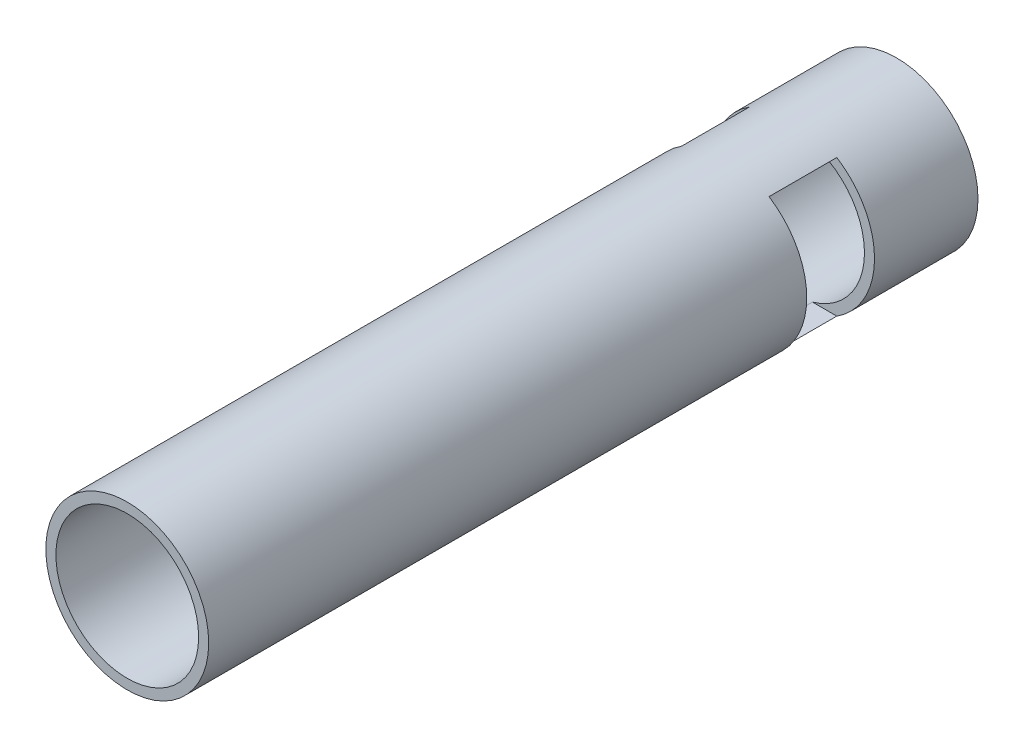
ISO-10303-21;
HEADER;
FILE_DESCRIPTION(('STEP AP214'),'2;1');
FILE_NAME('part.step','',(''),(''),'','','');
FILE_SCHEMA(('AUTOMOTIVE_DESIGN { 1 0 10303 214 1 1 1 1 }'));
ENDSEC;
DATA;
#1=APPLICATION_CONTEXT('core data for automotive mechanical design processes');
#2=APPLICATION_PROTOCOL_DEFINITION('international standard','automotive_design',2000,#1);
#3=PRODUCT_CONTEXT('',#1,'mechanical');
#4=PRODUCT('Part','Part','',(#3));
#5=PRODUCT_RELATED_PRODUCT_CATEGORY('part','',(#4));
#6=PRODUCT_DEFINITION_FORMATION('','',#4);
#7=PRODUCT_DEFINITION_CONTEXT('part definition',#1,'design');
#8=PRODUCT_DEFINITION('design','',#6,#7);
#9=PRODUCT_DEFINITION_SHAPE('','',#8);
#10=(LENGTH_UNIT() NAMED_UNIT(*) SI_UNIT(.MILLI.,.METRE.));
#11=(NAMED_UNIT(*) PLANE_ANGLE_UNIT() SI_UNIT($,.RADIAN.));
#12=(NAMED_UNIT(*) SI_UNIT($,.STERADIAN.) SOLID_ANGLE_UNIT());
#13=UNCERTAINTY_MEASURE_WITH_UNIT(LENGTH_MEASURE(1.E-05),#10,'distance_accuracy_value','');
#14=(GEOMETRIC_REPRESENTATION_CONTEXT(3) GLOBAL_UNCERTAINTY_ASSIGNED_CONTEXT((#13)) GLOBAL_UNIT_ASSIGNED_CONTEXT((#10,
#11,#12)) REPRESENTATION_CONTEXT('',''));
#15=CARTESIAN_POINT('',(0.,0.,0.));
#16=DIRECTION('',(0.,0.,1.));
#17=DIRECTION('',(1.,0.,0.));
#18=AXIS2_PLACEMENT_3D('',#15,#16,#17);
#19=CARTESIAN_POINT('',(0.,0.,420.));
#20=DIRECTION('',(0.,0.,-1.));
#21=DIRECTION('',(-1.,0.,0.));
#22=AXIS2_PLACEMENT_3D('',#19,#20,#21);
#23=CYLINDRICAL_SURFACE('',#22,44.45);
#24=CARTESIAN_POINT('',(0.,0.,56.5));
#25=DIRECTION('',(0.,0.,1.));
#26=DIRECTION('',(0.,-1.,0.));
#27=AXIS2_PLACEMENT_3D('',#24,#25,#26);
#28=CIRCLE('',#27,44.45);
#29=CARTESIAN_POINT('',(-23.8652990762739,37.5,56.5));
#30=VERTEX_POINT('',#29);
#31=CARTESIAN_POINT('',(-23.8652990762739,-37.5,56.5));
#32=VERTEX_POINT('',#31);
#33=EDGE_CURVE('E155',#30,#32,#28,.T.);
#34=ORIENTED_EDGE('',*,*,#33,.F.);
#35=DIRECTION('',(0.,0.,-1.));
#36=VECTOR('',#35,1.);
#37=CARTESIAN_POINT('',(-23.8652990762739,37.5,420.));
#38=LINE('',#37,#36);
#39=CARTESIAN_POINT('',(-23.8652990762739,37.5,93.5));
#40=VERTEX_POINT('',#39);
#41=EDGE_CURVE('E157',#40,#30,#38,.T.);
#42=ORIENTED_EDGE('',*,*,#41,.F.);
#43=CARTESIAN_POINT('',(0.,0.,93.5));
#44=DIRECTION('',(0.,0.,-1.));
#45=DIRECTION('',(-1.,0.,0.));
#46=AXIS2_PLACEMENT_3D('',#43,#44,#45);
#47=CIRCLE('',#46,44.45);
#48=CARTESIAN_POINT('',(-23.8652990762739,-37.5,93.5));
#49=VERTEX_POINT('',#48);
#50=EDGE_CURVE('E161',#49,#40,#47,.T.);
#51=ORIENTED_EDGE('',*,*,#50,.F.);
#52=DIRECTION('',(0.,0.,-1.));
#53=VECTOR('',#52,1.);
#54=CARTESIAN_POINT('',(-23.8652990762739,-37.5,420.));
#55=LINE('',#54,#53);
#56=EDGE_CURVE('E165',#32,#49,#55,.F.);
#57=ORIENTED_EDGE('',*,*,#56,.F.);
#58=EDGE_LOOP('',(#34,#42,#51,#57));
#59=FACE_BOUND('',#58,.T.);
#60=CARTESIAN_POINT('',(0.,0.,420.));
#61=DIRECTION('',(0.,0.,1.));
#62=DIRECTION('',(1.,0.,0.));
#63=AXIS2_PLACEMENT_3D('',#60,#61,#62);
#64=CIRCLE('',#63,44.45);
#65=CARTESIAN_POINT('',(44.45,0.,420.));
#66=VERTEX_POINT('',#65);
#67=EDGE_CURVE('E140',#66,#66,#64,.T.);
#68=ORIENTED_EDGE('',*,*,#67,.F.);
#69=EDGE_LOOP('',(#68));
#70=FACE_BOUND('',#69,.T.);
#71=CARTESIAN_POINT('',(0.,0.,0.));
#72=DIRECTION('',(0.,0.,1.));
#73=DIRECTION('',(1.,0.,0.));
#74=AXIS2_PLACEMENT_3D('',#71,#72,#73);
#75=CIRCLE('',#74,44.45);
#76=CARTESIAN_POINT('',(44.45,0.,0.));
#77=VERTEX_POINT('',#76);
#78=EDGE_CURVE('E143',#77,#77,#75,.T.);
#79=ORIENTED_EDGE('',*,*,#78,.T.);
#80=EDGE_LOOP('',(#79));
#81=FACE_BOUND('',#80,.T.);
#82=CARTESIAN_POINT('',(23.8652990762739,-37.5,56.5));
#83=VERTEX_POINT('',#82);
#84=CARTESIAN_POINT('',(23.8652990762739,37.5,56.5));
#85=VERTEX_POINT('',#84);
#86=EDGE_CURVE('E152',#83,#85,#28,.T.);
#87=ORIENTED_EDGE('',*,*,#86,.F.);
#88=DIRECTION('',(0.,0.,-1.));
#89=VECTOR('',#88,1.);
#90=CARTESIAN_POINT('',(23.8652990762739,-37.5,420.));
#91=LINE('',#90,#89);
#92=CARTESIAN_POINT('',(23.8652990762739,-37.5,93.5));
#93=VERTEX_POINT('',#92);
#94=EDGE_CURVE('E163',#93,#83,#91,.T.);
#95=ORIENTED_EDGE('',*,*,#94,.F.);
#96=CARTESIAN_POINT('',(23.8652990762739,37.5,93.5));
#97=VERTEX_POINT('',#96);
#98=EDGE_CURVE('E122',#97,#93,#47,.T.);
#99=ORIENTED_EDGE('',*,*,#98,.F.);
#100=DIRECTION('',(0.,0.,-1.));
#101=VECTOR('',#100,1.);
#102=CARTESIAN_POINT('',(23.8652990762739,37.5,420.));
#103=LINE('',#102,#101);
#104=EDGE_CURVE('E159',#85,#97,#103,.F.);
#105=ORIENTED_EDGE('',*,*,#104,.F.);
#106=EDGE_LOOP('',(#87,#95,#99,#105));
#107=FACE_BOUND('',#106,.T.);
#108=ADVANCED_FACE('F45',(#59,#70,#81,#107),#23,.T.);
#109=CARTESIAN_POINT('',(0.,0.,420.));
#110=DIRECTION('',(0.,0.,-1.));
#111=DIRECTION('',(-1.,0.,0.));
#112=AXIS2_PLACEMENT_3D('',#109,#110,#111);
#113=CYLINDRICAL_SURFACE('',#112,38.9636);
#114=CARTESIAN_POINT('',(0.,0.,420.));
#115=DIRECTION('',(0.,0.,1.));
#116=DIRECTION('',(1.,0.,0.));
#117=AXIS2_PLACEMENT_3D('',#114,#115,#116);
#118=CIRCLE('',#117,38.9636);
#119=CARTESIAN_POINT('',(38.9636,0.,420.));
#120=VERTEX_POINT('',#119);
#121=EDGE_CURVE('E147',#120,#120,#118,.T.);
#122=ORIENTED_EDGE('',*,*,#121,.T.);
#123=EDGE_LOOP('',(#122));
#124=FACE_BOUND('',#123,.T.);
#125=CARTESIAN_POINT('',(0.,0.,0.));
#126=DIRECTION('',(0.,0.,1.));
#127=DIRECTION('',(1.,0.,0.));
#128=AXIS2_PLACEMENT_3D('',#125,#126,#127);
#129=CIRCLE('',#128,38.9636);
#130=CARTESIAN_POINT('',(38.9636,0.,0.));
#131=VERTEX_POINT('',#130);
#132=EDGE_CURVE('E149',#131,#131,#129,.T.);
#133=ORIENTED_EDGE('',*,*,#132,.F.);
#134=EDGE_LOOP('',(#133));
#135=FACE_BOUND('',#134,.T.);
#136=DIRECTION('',(0.,0.,-1.));
#137=VECTOR('',#136,1.);
#138=CARTESIAN_POINT('',(-10.5788527241852,37.5,420.));
#139=LINE('',#138,#137);
#140=CARTESIAN_POINT('',(-10.5788527241852,37.5,93.5));
#141=VERTEX_POINT('',#140);
#142=CARTESIAN_POINT('',(-10.5788527241852,37.5,56.5));
#143=VERTEX_POINT('',#142);
#144=EDGE_CURVE('E134',#141,#143,#139,.T.);
#145=ORIENTED_EDGE('',*,*,#144,.T.);
#146=CARTESIAN_POINT('',(0.,0.,56.5));
#147=DIRECTION('',(0.,0.,1.));
#148=DIRECTION('',(0.,-1.,0.));
#149=AXIS2_PLACEMENT_3D('',#146,#147,#148);
#150=CIRCLE('',#149,38.9636);
#151=CARTESIAN_POINT('',(-10.5788527241852,-37.5,56.5));
#152=VERTEX_POINT('',#151);
#153=EDGE_CURVE('E54',#143,#152,#150,.T.);
#154=ORIENTED_EDGE('',*,*,#153,.T.);
#155=DIRECTION('',(0.,0.,-1.));
#156=VECTOR('',#155,1.);
#157=CARTESIAN_POINT('',(-10.5788527241852,-37.5,420.));
#158=LINE('',#157,#156);
#159=CARTESIAN_POINT('',(-10.5788527241852,-37.5,93.5));
#160=VERTEX_POINT('',#159);
#161=EDGE_CURVE('E135',#152,#160,#158,.F.);
#162=ORIENTED_EDGE('',*,*,#161,.T.);
#163=CARTESIAN_POINT('',(0.,0.,93.5));
#164=DIRECTION('',(0.,0.,-1.));
#165=DIRECTION('',(-1.,0.,0.));
#166=AXIS2_PLACEMENT_3D('',#163,#164,#165);
#167=CIRCLE('',#166,38.9636);
#168=EDGE_CURVE('E130',#160,#141,#167,.T.);
#169=ORIENTED_EDGE('',*,*,#168,.T.);
#170=EDGE_LOOP('',(#145,#154,#162,#169));
#171=FACE_BOUND('',#170,.T.);
#172=DIRECTION('',(0.,0.,-1.));
#173=VECTOR('',#172,1.);
#174=CARTESIAN_POINT('',(10.5788527241852,-37.5,420.));
#175=LINE('',#174,#173);
#176=CARTESIAN_POINT('',(10.5788527241852,-37.5,93.5));
#177=VERTEX_POINT('',#176);
#178=CARTESIAN_POINT('',(10.5788527241852,-37.5,56.5));
#179=VERTEX_POINT('',#178);
#180=EDGE_CURVE('E109',#177,#179,#175,.T.);
#181=ORIENTED_EDGE('',*,*,#180,.T.);
#182=CARTESIAN_POINT('',(10.5788527241852,37.5,56.5));
#183=VERTEX_POINT('',#182);
#184=EDGE_CURVE('E11',#179,#183,#150,.T.);
#185=ORIENTED_EDGE('',*,*,#184,.T.);
#186=DIRECTION('',(0.,0.,-1.));
#187=VECTOR('',#186,1.);
#188=CARTESIAN_POINT('',(10.5788527241852,37.5,420.));
#189=LINE('',#188,#187);
#190=CARTESIAN_POINT('',(10.5788527241852,37.5,93.5));
#191=VERTEX_POINT('',#190);
#192=EDGE_CURVE('E48',#183,#191,#189,.F.);
#193=ORIENTED_EDGE('',*,*,#192,.T.);
#194=EDGE_CURVE('E116',#191,#177,#167,.T.);
#195=ORIENTED_EDGE('',*,*,#194,.T.);
#196=EDGE_LOOP('',(#181,#185,#193,#195));
#197=FACE_BOUND('',#196,.T.);
#198=ADVANCED_FACE('F128',(#124,#135,#171,#197),#113,.F.);
#199=CARTESIAN_POINT('',(0.,0.,420.));
#200=DIRECTION('',(0.,0.,1.));
#201=DIRECTION('',(1.,0.,0.));
#202=AXIS2_PLACEMENT_3D('',#199,#200,#201);
#203=PLANE('',#202);
#204=ORIENTED_EDGE('',*,*,#67,.T.);
#205=EDGE_LOOP('',(#204));
#206=FACE_BOUND('',#205,.T.);
#207=ORIENTED_EDGE('',*,*,#121,.F.);
#208=EDGE_LOOP('',(#207));
#209=FACE_BOUND('',#208,.T.);
#210=ADVANCED_FACE('F190',(#206,#209),#203,.T.);
#211=CARTESIAN_POINT('',(0.,0.,0.));
#212=DIRECTION('',(0.,0.,1.));
#213=DIRECTION('',(1.,0.,0.));
#214=AXIS2_PLACEMENT_3D('',#211,#212,#213);
#215=PLANE('',#214);
#216=ORIENTED_EDGE('',*,*,#78,.F.);
#217=EDGE_LOOP('',(#216));
#218=FACE_BOUND('',#217,.T.);
#219=ORIENTED_EDGE('',*,*,#132,.T.);
#220=EDGE_LOOP('',(#219));
#221=FACE_BOUND('',#220,.T.);
#222=ADVANCED_FACE('F197',(#218,#221),#215,.F.);
#223=CARTESIAN_POINT('',(50.,-37.5,93.5));
#224=DIRECTION('',(0.,1.,0.));
#225=DIRECTION('',(0.,0.,1.));
#226=AXIS2_PLACEMENT_3D('',#223,#224,#225);
#227=PLANE('',#226);
#228=ORIENTED_EDGE('',*,*,#56,.T.);
#229=DIRECTION('',(-1.,0.,0.));
#230=VECTOR('',#229,1.);
#231=CARTESIAN_POINT('',(50.,-37.5,93.5));
#232=LINE('',#231,#230);
#233=EDGE_CURVE('E125',#160,#49,#232,.T.);
#234=ORIENTED_EDGE('',*,*,#233,.F.);
#235=ORIENTED_EDGE('',*,*,#161,.F.);
#236=DIRECTION('',(-1.,0.,0.));
#237=VECTOR('',#236,1.);
#238=CARTESIAN_POINT('',(50.,-37.5,56.5));
#239=LINE('',#238,#237);
#240=EDGE_CURVE('E69',#152,#32,#239,.T.);
#241=ORIENTED_EDGE('',*,*,#240,.T.);
#242=EDGE_LOOP('',(#228,#234,#235,#241));
#243=FACE_BOUND('',#242,.T.);
#244=ADVANCED_FACE('F205',(#243),#227,.T.);
#245=CARTESIAN_POINT('',(50.,37.5,93.5));
#246=DIRECTION('',(0.,0.,-1.));
#247=DIRECTION('',(-1.,0.,0.));
#248=AXIS2_PLACEMENT_3D('',#245,#246,#247);
#249=PLANE('',#248);
#250=ORIENTED_EDGE('',*,*,#50,.T.);
#251=DIRECTION('',(-1.,0.,0.));
#252=VECTOR('',#251,1.);
#253=CARTESIAN_POINT('',(50.,37.5,93.5));
#254=LINE('',#253,#252);
#255=EDGE_CURVE('E124',#141,#40,#254,.T.);
#256=ORIENTED_EDGE('',*,*,#255,.F.);
#257=ORIENTED_EDGE('',*,*,#168,.F.);
#258=ORIENTED_EDGE('',*,*,#233,.T.);
#259=EDGE_LOOP('',(#250,#256,#257,#258));
#260=FACE_BOUND('',#259,.T.);
#261=ADVANCED_FACE('F177',(#260),#249,.T.);
#262=CARTESIAN_POINT('',(50.,37.5,93.5));
#263=DIRECTION('',(0.,-1.,0.));
#264=DIRECTION('',(0.,0.,-1.));
#265=AXIS2_PLACEMENT_3D('',#262,#263,#264);
#266=PLANE('',#265);
#267=ORIENTED_EDGE('',*,*,#41,.T.);
#268=DIRECTION('',(-1.,0.,0.));
#269=VECTOR('',#268,1.);
#270=CARTESIAN_POINT('',(50.,37.5,56.5));
#271=LINE('',#270,#269);
#272=EDGE_CURVE('E168',#143,#30,#271,.T.);
#273=ORIENTED_EDGE('',*,*,#272,.F.);
#274=ORIENTED_EDGE('',*,*,#144,.F.);
#275=ORIENTED_EDGE('',*,*,#255,.T.);
#276=EDGE_LOOP('',(#267,#273,#274,#275));
#277=FACE_BOUND('',#276,.T.);
#278=ADVANCED_FACE('F186',(#277),#266,.T.);
#279=CARTESIAN_POINT('',(50.,37.5,56.5));
#280=DIRECTION('',(0.,0.,1.));
#281=DIRECTION('',(0.,-1.,0.));
#282=AXIS2_PLACEMENT_3D('',#279,#280,#281);
#283=PLANE('',#282);
#284=ORIENTED_EDGE('',*,*,#33,.T.);
#285=ORIENTED_EDGE('',*,*,#240,.F.);
#286=ORIENTED_EDGE('',*,*,#153,.F.);
#287=ORIENTED_EDGE('',*,*,#272,.T.);
#288=EDGE_LOOP('',(#284,#285,#286,#287));
#289=FACE_BOUND('',#288,.T.);
#290=ADVANCED_FACE('F188',(#289),#283,.T.);
#291=ORIENTED_EDGE('',*,*,#86,.T.);
#292=EDGE_CURVE('E167',#85,#183,#271,.T.);
#293=ORIENTED_EDGE('',*,*,#292,.T.);
#294=ORIENTED_EDGE('',*,*,#184,.F.);
#295=EDGE_CURVE('E112',#83,#179,#239,.T.);
#296=ORIENTED_EDGE('',*,*,#295,.F.);
#297=EDGE_LOOP('',(#291,#293,#294,#296));
#298=FACE_BOUND('',#297,.T.);
#299=ADVANCED_FACE('F202',(#298),#283,.T.);
#300=ORIENTED_EDGE('',*,*,#104,.T.);
#301=EDGE_CURVE('E171',#97,#191,#254,.T.);
#302=ORIENTED_EDGE('',*,*,#301,.T.);
#303=ORIENTED_EDGE('',*,*,#192,.F.);
#304=ORIENTED_EDGE('',*,*,#292,.F.);
#305=EDGE_LOOP('',(#300,#302,#303,#304));
#306=FACE_BOUND('',#305,.T.);
#307=ADVANCED_FACE('F222',(#306),#266,.T.);
#308=ORIENTED_EDGE('',*,*,#98,.T.);
#309=EDGE_CURVE('E61',#93,#177,#232,.T.);
#310=ORIENTED_EDGE('',*,*,#309,.T.);
#311=ORIENTED_EDGE('',*,*,#194,.F.);
#312=ORIENTED_EDGE('',*,*,#301,.F.);
#313=EDGE_LOOP('',(#308,#310,#311,#312));
#314=FACE_BOUND('',#313,.T.);
#315=ADVANCED_FACE('F118',(#314),#249,.T.);
#316=ORIENTED_EDGE('',*,*,#94,.T.);
#317=ORIENTED_EDGE('',*,*,#295,.T.);
#318=ORIENTED_EDGE('',*,*,#180,.F.);
#319=ORIENTED_EDGE('',*,*,#309,.F.);
#320=EDGE_LOOP('',(#316,#317,#318,#319));
#321=FACE_BOUND('',#320,.T.);
#322=ADVANCED_FACE('F110',(#321),#227,.T.);
#323=CLOSED_SHELL('',(#108,#198,#210,#222,#244,#261,#278,#290,#299,#307,#315,#322));
#324=MANIFOLD_SOLID_BREP('B2',#323);
#325=ADVANCED_BREP_SHAPE_REPRESENTATION('',(#18,#324),#14);
#326=SHAPE_DEFINITION_REPRESENTATION(#9,#325);
ENDSEC;
END-ISO-10303-21;
